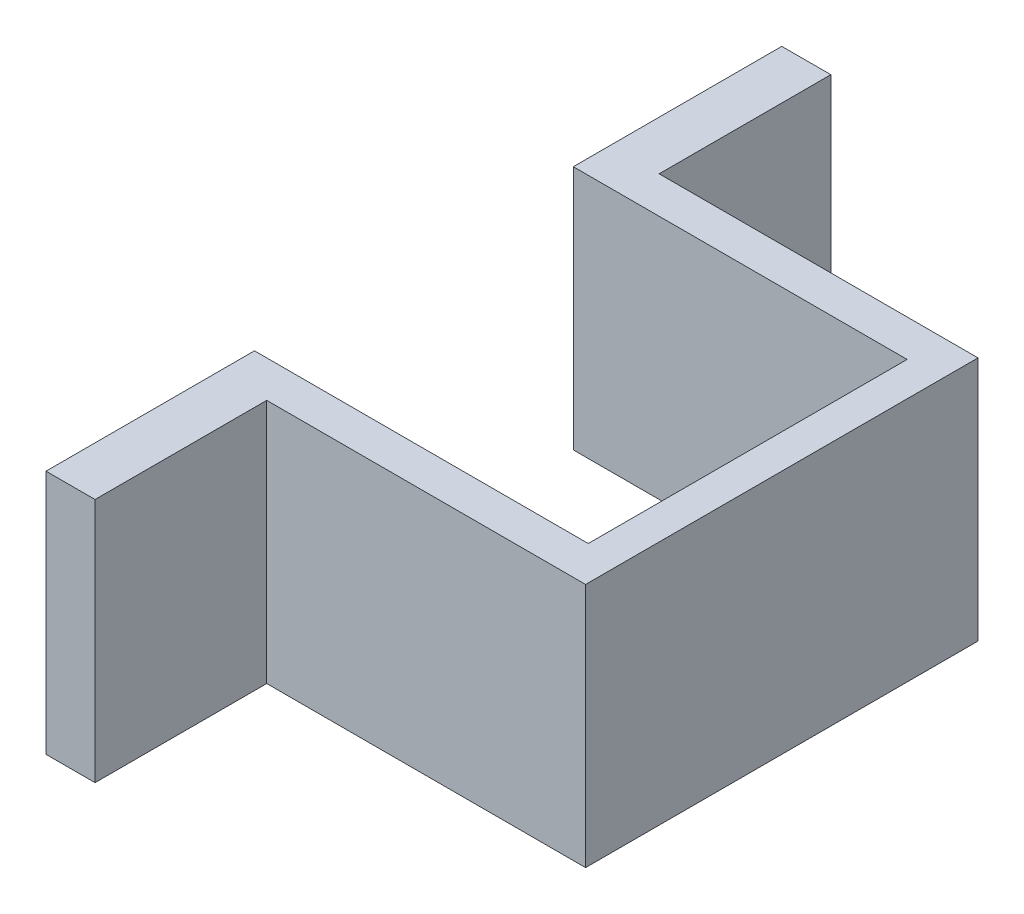
ISO-10303-21;
HEADER;
FILE_DESCRIPTION(('STEP AP214'),'2;1');
FILE_NAME('part.step','',(''),(''),'','','');
FILE_SCHEMA(('AUTOMOTIVE_DESIGN { 1 0 10303 214 1 1 1 1 }'));
ENDSEC;
DATA;
#1=APPLICATION_CONTEXT('core data for automotive mechanical design processes');
#2=APPLICATION_PROTOCOL_DEFINITION('international standard','automotive_design',2000,#1);
#3=PRODUCT_CONTEXT('',#1,'mechanical');
#4=PRODUCT('Part','Part','',(#3));
#5=PRODUCT_RELATED_PRODUCT_CATEGORY('part','',(#4));
#6=PRODUCT_DEFINITION_FORMATION('','',#4);
#7=PRODUCT_DEFINITION_CONTEXT('part definition',#1,'design');
#8=PRODUCT_DEFINITION('design','',#6,#7);
#9=PRODUCT_DEFINITION_SHAPE('','',#8);
#10=(LENGTH_UNIT() NAMED_UNIT(*) SI_UNIT(.MILLI.,.METRE.));
#11=(NAMED_UNIT(*) PLANE_ANGLE_UNIT() SI_UNIT($,.RADIAN.));
#12=(NAMED_UNIT(*) SI_UNIT($,.STERADIAN.) SOLID_ANGLE_UNIT());
#13=UNCERTAINTY_MEASURE_WITH_UNIT(LENGTH_MEASURE(1.E-05),#10,'distance_accuracy_value','');
#14=(GEOMETRIC_REPRESENTATION_CONTEXT(3) GLOBAL_UNCERTAINTY_ASSIGNED_CONTEXT((#13)) GLOBAL_UNIT_ASSIGNED_CONTEXT((#10,
#11,#12)) REPRESENTATION_CONTEXT('',''));
#15=CARTESIAN_POINT('',(0.,0.,0.));
#16=DIRECTION('',(0.,0.,1.));
#17=DIRECTION('',(1.,0.,0.));
#18=AXIS2_PLACEMENT_3D('',#15,#16,#17);
#19=CARTESIAN_POINT('',(8.84,0.,0.));
#20=DIRECTION('',(-1.,0.,0.));
#21=DIRECTION('',(0.,0.,1.));
#22=AXIS2_PLACEMENT_3D('',#19,#20,#21);
#23=PLANE('',#22);
#24=DIRECTION('',(0.,-1.,0.));
#25=VECTOR('',#24,1.);
#26=CARTESIAN_POINT('',(8.83999999999999,0.,-15.));
#27=LINE('',#26,#25);
#28=CARTESIAN_POINT('',(8.84,49.5,-15.));
#29=VERTEX_POINT('',#28);
#30=CARTESIAN_POINT('',(8.84,39.5,-15.));
#31=VERTEX_POINT('',#30);
#32=EDGE_CURVE('E39',#29,#31,#27,.T.);
#33=ORIENTED_EDGE('',*,*,#32,.T.);
#34=DIRECTION('',(0.,0.,-1.));
#35=VECTOR('',#34,1.);
#36=CARTESIAN_POINT('',(8.84,39.5,0.));
#37=LINE('',#36,#35);
#38=CARTESIAN_POINT('',(8.84,39.5,-6.5));
#39=VERTEX_POINT('',#38);
#40=EDGE_CURVE('E50',#39,#31,#37,.T.);
#41=ORIENTED_EDGE('',*,*,#40,.F.);
#42=DIRECTION('',(0.,-1.,0.));
#43=VECTOR('',#42,1.);
#44=CARTESIAN_POINT('',(8.84,49.5,-6.5));
#45=LINE('',#44,#43);
#46=CARTESIAN_POINT('',(8.84,49.5,-6.5));
#47=VERTEX_POINT('',#46);
#48=EDGE_CURVE('E210',#47,#39,#45,.T.);
#49=ORIENTED_EDGE('',*,*,#48,.F.);
#50=DIRECTION('',(0.,0.,-1.));
#51=VECTOR('',#50,1.);
#52=CARTESIAN_POINT('',(8.84,49.5,0.));
#53=LINE('',#52,#51);
#54=EDGE_CURVE('E211',#47,#29,#53,.T.);
#55=ORIENTED_EDGE('',*,*,#54,.T.);
#56=EDGE_LOOP('',(#33,#41,#49,#55));
#57=FACE_BOUND('',#56,.T.);
#58=ADVANCED_FACE('F35',(#57),#23,.T.);
#59=CARTESIAN_POINT('',(0.,0.,15.));
#60=DIRECTION('',(0.,0.,-1.));
#61=DIRECTION('',(-1.,0.,0.));
#62=AXIS2_PLACEMENT_3D('',#59,#60,#61);
#63=PLANE('',#62);
#64=DIRECTION('',(1.,0.,0.));
#65=VECTOR('',#64,1.);
#66=CARTESIAN_POINT('',(0.,49.5,15.));
#67=LINE('',#66,#65);
#68=CARTESIAN_POINT('',(8.84,49.5,15.));
#69=VERTEX_POINT('',#68);
#70=CARTESIAN_POINT('',(10.84,49.5,15.));
#71=VERTEX_POINT('',#70);
#72=EDGE_CURVE('E150',#69,#71,#67,.T.);
#73=ORIENTED_EDGE('',*,*,#72,.F.);
#74=DIRECTION('',(0.,-1.,0.));
#75=VECTOR('',#74,1.);
#76=CARTESIAN_POINT('',(8.83999999999999,0.,15.));
#77=LINE('',#76,#75);
#78=CARTESIAN_POINT('',(8.84,39.5,15.));
#79=VERTEX_POINT('',#78);
#80=EDGE_CURVE('E215',#69,#79,#77,.T.);
#81=ORIENTED_EDGE('',*,*,#80,.T.);
#82=DIRECTION('',(-1.,0.,0.));
#83=VECTOR('',#82,1.);
#84=CARTESIAN_POINT('',(23.84,39.5,15.));
#85=LINE('',#84,#83);
#86=CARTESIAN_POINT('',(10.84,39.5,15.));
#87=VERTEX_POINT('',#86);
#88=EDGE_CURVE('E191',#87,#79,#85,.T.);
#89=ORIENTED_EDGE('',*,*,#88,.F.);
#90=DIRECTION('',(0.,1.,0.));
#91=VECTOR('',#90,1.);
#92=CARTESIAN_POINT('',(10.84,36.5,15.));
#93=LINE('',#92,#91);
#94=EDGE_CURVE('E136',#87,#71,#93,.T.);
#95=ORIENTED_EDGE('',*,*,#94,.T.);
#96=EDGE_LOOP('',(#73,#81,#89,#95));
#97=FACE_BOUND('',#96,.T.);
#98=ADVANCED_FACE('F249',(#97),#63,.F.);
#99=CARTESIAN_POINT('',(0.,39.5,0.));
#100=DIRECTION('',(0.,1.,0.));
#101=DIRECTION('',(0.,0.,1.));
#102=AXIS2_PLACEMENT_3D('',#99,#100,#101);
#103=PLANE('',#102);
#104=ORIENTED_EDGE('',*,*,#88,.T.);
#105=CARTESIAN_POINT('',(8.84,39.5,6.5));
#106=VERTEX_POINT('',#105);
#107=EDGE_CURVE('E214',#79,#106,#37,.T.);
#108=ORIENTED_EDGE('',*,*,#107,.T.);
#109=DIRECTION('',(1.,0.,0.));
#110=VECTOR('',#109,1.);
#111=CARTESIAN_POINT('',(0.,39.5,6.5));
#112=LINE('',#111,#110);
#113=CARTESIAN_POINT('',(22.45,39.5,6.5));
#114=VERTEX_POINT('',#113);
#115=EDGE_CURVE('E200',#106,#114,#112,.T.);
#116=ORIENTED_EDGE('',*,*,#115,.T.);
#117=DIRECTION('',(0.,0.,-1.));
#118=VECTOR('',#117,1.);
#119=CARTESIAN_POINT('',(22.45,39.5,0.));
#120=LINE('',#119,#118);
#121=CARTESIAN_POINT('',(22.45,39.5,-6.5));
#122=VERTEX_POINT('',#121);
#123=EDGE_CURVE('E176',#114,#122,#120,.T.);
#124=ORIENTED_EDGE('',*,*,#123,.T.);
#125=DIRECTION('',(1.,0.,0.));
#126=VECTOR('',#125,1.);
#127=CARTESIAN_POINT('',(0.,39.5,-6.5));
#128=LINE('',#127,#126);
#129=EDGE_CURVE('E194',#39,#122,#128,.T.);
#130=ORIENTED_EDGE('',*,*,#129,.F.);
#131=ORIENTED_EDGE('',*,*,#40,.T.);
#132=DIRECTION('',(-1.,0.,0.));
#133=VECTOR('',#132,1.);
#134=CARTESIAN_POINT('',(23.84,39.5,-15.));
#135=LINE('',#134,#133);
#136=CARTESIAN_POINT('',(10.84,39.5,-15.));
#137=VERTEX_POINT('',#136);
#138=EDGE_CURVE('E188',#137,#31,#135,.T.);
#139=ORIENTED_EDGE('',*,*,#138,.F.);
#140=DIRECTION('',(0.,0.,1.));
#141=VECTOR('',#140,1.);
#142=CARTESIAN_POINT('',(10.84,39.5,0.));
#143=LINE('',#142,#141);
#144=CARTESIAN_POINT('',(10.84,39.5,-8.));
#145=VERTEX_POINT('',#144);
#146=EDGE_CURVE('E179',#137,#145,#143,.T.);
#147=ORIENTED_EDGE('',*,*,#146,.T.);
#148=DIRECTION('',(1.,0.,0.));
#149=VECTOR('',#148,1.);
#150=CARTESIAN_POINT('',(0.,39.5,-8.));
#151=LINE('',#150,#149);
#152=CARTESIAN_POINT('',(23.84,39.5,-8.));
#153=VERTEX_POINT('',#152);
#154=EDGE_CURVE('E153',#145,#153,#151,.T.);
#155=ORIENTED_EDGE('',*,*,#154,.T.);
#156=DIRECTION('',(0.,0.,-1.));
#157=VECTOR('',#156,1.);
#158=CARTESIAN_POINT('',(23.84,39.5,15.));
#159=LINE('',#158,#157);
#160=CARTESIAN_POINT('',(23.84,39.5,8.));
#161=VERTEX_POINT('',#160);
#162=EDGE_CURVE('E183',#161,#153,#159,.T.);
#163=ORIENTED_EDGE('',*,*,#162,.F.);
#164=DIRECTION('',(1.,0.,0.));
#165=VECTOR('',#164,1.);
#166=CARTESIAN_POINT('',(0.,39.5,8.));
#167=LINE('',#166,#165);
#168=CARTESIAN_POINT('',(10.84,39.5,8.));
#169=VERTEX_POINT('',#168);
#170=EDGE_CURVE('E174',#169,#161,#167,.T.);
#171=ORIENTED_EDGE('',*,*,#170,.F.);
#172=DIRECTION('',(0.,0.,-1.));
#173=VECTOR('',#172,1.);
#174=CARTESIAN_POINT('',(10.84,39.5,0.));
#175=LINE('',#174,#173);
#176=EDGE_CURVE('E133',#87,#169,#175,.T.);
#177=ORIENTED_EDGE('',*,*,#176,.F.);
#178=EDGE_LOOP('',(#104,#108,#116,#124,#130,#131,#139,#147,#155,#163,#171,#177));
#179=FACE_BOUND('',#178,.T.);
#180=ADVANCED_FACE('F224',(#179),#103,.F.);
#181=CARTESIAN_POINT('',(0.,49.5,0.));
#182=DIRECTION('',(0.,1.,0.));
#183=DIRECTION('',(0.,0.,1.));
#184=AXIS2_PLACEMENT_3D('',#181,#182,#183);
#185=PLANE('',#184);
#186=CARTESIAN_POINT('',(8.84,49.5,6.5));
#187=VERTEX_POINT('',#186);
#188=EDGE_CURVE('E57',#69,#187,#53,.T.);
#189=ORIENTED_EDGE('',*,*,#188,.F.);
#190=ORIENTED_EDGE('',*,*,#72,.T.);
#191=DIRECTION('',(0.,0.,-1.));
#192=VECTOR('',#191,1.);
#193=CARTESIAN_POINT('',(10.84,49.5,0.));
#194=LINE('',#193,#192);
#195=CARTESIAN_POINT('',(10.84,49.5,8.));
#196=VERTEX_POINT('',#195);
#197=EDGE_CURVE('E130',#71,#196,#194,.T.);
#198=ORIENTED_EDGE('',*,*,#197,.T.);
#199=DIRECTION('',(1.,0.,0.));
#200=VECTOR('',#199,1.);
#201=CARTESIAN_POINT('',(0.,49.5,8.));
#202=LINE('',#201,#200);
#203=CARTESIAN_POINT('',(23.84,49.5,8.));
#204=VERTEX_POINT('',#203);
#205=EDGE_CURVE('E139',#196,#204,#202,.T.);
#206=ORIENTED_EDGE('',*,*,#205,.T.);
#207=DIRECTION('',(0.,0.,1.));
#208=VECTOR('',#207,1.);
#209=CARTESIAN_POINT('',(23.84,49.5,15.));
#210=LINE('',#209,#208);
#211=CARTESIAN_POINT('',(23.84,49.5,-8.));
#212=VERTEX_POINT('',#211);
#213=EDGE_CURVE('E186',#212,#204,#210,.T.);
#214=ORIENTED_EDGE('',*,*,#213,.F.);
#215=DIRECTION('',(1.,0.,0.));
#216=VECTOR('',#215,1.);
#217=CARTESIAN_POINT('',(0.,49.5,-8.));
#218=LINE('',#217,#216);
#219=CARTESIAN_POINT('',(10.84,49.5,-8.));
#220=VERTEX_POINT('',#219);
#221=EDGE_CURVE('E158',#220,#212,#218,.T.);
#222=ORIENTED_EDGE('',*,*,#221,.F.);
#223=DIRECTION('',(0.,0.,1.));
#224=VECTOR('',#223,1.);
#225=CARTESIAN_POINT('',(10.84,49.5,0.));
#226=LINE('',#225,#224);
#227=CARTESIAN_POINT('',(10.84,49.5,-15.));
#228=VERTEX_POINT('',#227);
#229=EDGE_CURVE('E155',#228,#220,#226,.T.);
#230=ORIENTED_EDGE('',*,*,#229,.F.);
#231=DIRECTION('',(-1.,0.,0.));
#232=VECTOR('',#231,1.);
#233=CARTESIAN_POINT('',(0.,49.5,-15.));
#234=LINE('',#233,#232);
#235=EDGE_CURVE('E195',#228,#29,#234,.T.);
#236=ORIENTED_EDGE('',*,*,#235,.T.);
#237=ORIENTED_EDGE('',*,*,#54,.F.);
#238=DIRECTION('',(1.,0.,0.));
#239=VECTOR('',#238,1.);
#240=CARTESIAN_POINT('',(0.,49.5,-6.5));
#241=LINE('',#240,#239);
#242=CARTESIAN_POINT('',(22.45,49.5,-6.5));
#243=VERTEX_POINT('',#242);
#244=EDGE_CURVE('E198',#47,#243,#241,.T.);
#245=ORIENTED_EDGE('',*,*,#244,.T.);
#246=DIRECTION('',(0.,0.,-1.));
#247=VECTOR('',#246,1.);
#248=CARTESIAN_POINT('',(22.45,49.5,0.));
#249=LINE('',#248,#247);
#250=CARTESIAN_POINT('',(22.45,49.5,6.5));
#251=VERTEX_POINT('',#250);
#252=EDGE_CURVE('E164',#251,#243,#249,.T.);
#253=ORIENTED_EDGE('',*,*,#252,.F.);
#254=DIRECTION('',(1.,0.,0.));
#255=VECTOR('',#254,1.);
#256=CARTESIAN_POINT('',(0.,49.5,6.5));
#257=LINE('',#256,#255);
#258=EDGE_CURVE('E202',#187,#251,#257,.T.);
#259=ORIENTED_EDGE('',*,*,#258,.F.);
#260=EDGE_LOOP('',(#189,#190,#198,#206,#214,#222,#230,#236,#237,#245,#253,#259));
#261=FACE_BOUND('',#260,.T.);
#262=ADVANCED_FACE('F148',(#261),#185,.T.);
#263=CARTESIAN_POINT('',(23.84,0.,0.));
#264=DIRECTION('',(-1.,0.,0.));
#265=DIRECTION('',(0.,0.,1.));
#266=AXIS2_PLACEMENT_3D('',#263,#264,#265);
#267=PLANE('',#266);
#268=DIRECTION('',(0.,1.,0.));
#269=VECTOR('',#268,1.);
#270=CARTESIAN_POINT('',(23.84,0.,8.));
#271=LINE('',#270,#269);
#272=EDGE_CURVE('E142',#161,#204,#271,.T.);
#273=ORIENTED_EDGE('',*,*,#272,.F.);
#274=ORIENTED_EDGE('',*,*,#162,.T.);
#275=DIRECTION('',(0.,1.,0.));
#276=VECTOR('',#275,1.);
#277=CARTESIAN_POINT('',(23.84,0.,-8.));
#278=LINE('',#277,#276);
#279=EDGE_CURVE('E205',#153,#212,#278,.T.);
#280=ORIENTED_EDGE('',*,*,#279,.T.);
#281=ORIENTED_EDGE('',*,*,#213,.T.);
#282=EDGE_LOOP('',(#273,#274,#280,#281));
#283=FACE_BOUND('',#282,.T.);
#284=ADVANCED_FACE('F246',(#283),#267,.F.);
#285=CARTESIAN_POINT('',(0.,0.,-15.));
#286=DIRECTION('',(0.,0.,-1.));
#287=DIRECTION('',(-1.,0.,0.));
#288=AXIS2_PLACEMENT_3D('',#285,#286,#287);
#289=PLANE('',#288);
#290=ORIENTED_EDGE('',*,*,#32,.F.);
#291=ORIENTED_EDGE('',*,*,#235,.F.);
#292=DIRECTION('',(0.,1.,0.));
#293=VECTOR('',#292,1.);
#294=CARTESIAN_POINT('',(10.84,36.5,-15.));
#295=LINE('',#294,#293);
#296=EDGE_CURVE('E146',#137,#228,#295,.T.);
#297=ORIENTED_EDGE('',*,*,#296,.F.);
#298=ORIENTED_EDGE('',*,*,#138,.T.);
#299=EDGE_LOOP('',(#290,#291,#297,#298));
#300=FACE_BOUND('',#299,.T.);
#301=ADVANCED_FACE('F37',(#300),#289,.T.);
#302=CARTESIAN_POINT('',(0.,49.5,6.5));
#303=DIRECTION('',(0.,0.,-1.));
#304=DIRECTION('',(-1.,0.,0.));
#305=AXIS2_PLACEMENT_3D('',#302,#303,#304);
#306=PLANE('',#305);
#307=DIRECTION('',(0.,-1.,0.));
#308=VECTOR('',#307,1.);
#309=CARTESIAN_POINT('',(8.84,49.5,6.5));
#310=LINE('',#309,#308);
#311=EDGE_CURVE('E11',#187,#106,#310,.T.);
#312=ORIENTED_EDGE('',*,*,#311,.F.);
#313=ORIENTED_EDGE('',*,*,#258,.T.);
#314=DIRECTION('',(0.,1.,0.));
#315=VECTOR('',#314,1.);
#316=CARTESIAN_POINT('',(22.45,36.5,6.5));
#317=LINE('',#316,#315);
#318=EDGE_CURVE('E167',#114,#251,#317,.T.);
#319=ORIENTED_EDGE('',*,*,#318,.F.);
#320=ORIENTED_EDGE('',*,*,#115,.F.);
#321=EDGE_LOOP('',(#312,#313,#319,#320));
#322=FACE_BOUND('',#321,.T.);
#323=ADVANCED_FACE('F232',(#322),#306,.T.);
#324=CARTESIAN_POINT('',(0.,49.5,-6.5));
#325=DIRECTION('',(0.,0.,-1.));
#326=DIRECTION('',(-1.,0.,0.));
#327=AXIS2_PLACEMENT_3D('',#324,#325,#326);
#328=PLANE('',#327);
#329=ORIENTED_EDGE('',*,*,#244,.F.);
#330=ORIENTED_EDGE('',*,*,#48,.T.);
#331=ORIENTED_EDGE('',*,*,#129,.T.);
#332=DIRECTION('',(0.,1.,0.));
#333=VECTOR('',#332,1.);
#334=CARTESIAN_POINT('',(22.45,36.5,-6.5));
#335=LINE('',#334,#333);
#336=EDGE_CURVE('E159',#122,#243,#335,.T.);
#337=ORIENTED_EDGE('',*,*,#336,.T.);
#338=EDGE_LOOP('',(#329,#330,#331,#337));
#339=FACE_BOUND('',#338,.T.);
#340=ADVANCED_FACE('F220',(#339),#328,.F.);
#341=CARTESIAN_POINT('',(10.84,36.5,0.));
#342=DIRECTION('',(-1.,0.,0.));
#343=DIRECTION('',(0.,0.,1.));
#344=AXIS2_PLACEMENT_3D('',#341,#342,#343);
#345=PLANE('',#344);
#346=ORIENTED_EDGE('',*,*,#296,.T.);
#347=ORIENTED_EDGE('',*,*,#229,.T.);
#348=DIRECTION('',(0.,1.,0.));
#349=VECTOR('',#348,1.);
#350=CARTESIAN_POINT('',(10.84,36.5,-8.));
#351=LINE('',#350,#349);
#352=EDGE_CURVE('E161',#145,#220,#351,.T.);
#353=ORIENTED_EDGE('',*,*,#352,.F.);
#354=ORIENTED_EDGE('',*,*,#146,.F.);
#355=EDGE_LOOP('',(#346,#347,#353,#354));
#356=FACE_BOUND('',#355,.T.);
#357=ADVANCED_FACE('F241',(#356),#345,.F.);
#358=CARTESIAN_POINT('',(0.,36.5,-8.));
#359=DIRECTION('',(0.,0.,1.));
#360=DIRECTION('',(1.,0.,0.));
#361=AXIS2_PLACEMENT_3D('',#358,#359,#360);
#362=PLANE('',#361);
#363=ORIENTED_EDGE('',*,*,#352,.T.);
#364=ORIENTED_EDGE('',*,*,#221,.T.);
#365=ORIENTED_EDGE('',*,*,#279,.F.);
#366=ORIENTED_EDGE('',*,*,#154,.F.);
#367=EDGE_LOOP('',(#363,#364,#365,#366));
#368=FACE_BOUND('',#367,.T.);
#369=ADVANCED_FACE('F244',(#368),#362,.F.);
#370=CARTESIAN_POINT('',(10.84,36.5,0.));
#371=DIRECTION('',(1.,0.,0.));
#372=DIRECTION('',(0.,0.,-1.));
#373=AXIS2_PLACEMENT_3D('',#370,#371,#372);
#374=PLANE('',#373);
#375=ORIENTED_EDGE('',*,*,#176,.T.);
#376=DIRECTION('',(0.,1.,0.));
#377=VECTOR('',#376,1.);
#378=CARTESIAN_POINT('',(10.84,36.5,8.));
#379=LINE('',#378,#377);
#380=EDGE_CURVE('E126',#169,#196,#379,.T.);
#381=ORIENTED_EDGE('',*,*,#380,.T.);
#382=ORIENTED_EDGE('',*,*,#197,.F.);
#383=ORIENTED_EDGE('',*,*,#94,.F.);
#384=EDGE_LOOP('',(#375,#381,#382,#383));
#385=FACE_BOUND('',#384,.T.);
#386=ADVANCED_FACE('F128',(#385),#374,.T.);
#387=CARTESIAN_POINT('',(0.,36.5,8.));
#388=DIRECTION('',(0.,0.,1.));
#389=DIRECTION('',(1.,0.,0.));
#390=AXIS2_PLACEMENT_3D('',#387,#388,#389);
#391=PLANE('',#390);
#392=ORIENTED_EDGE('',*,*,#170,.T.);
#393=ORIENTED_EDGE('',*,*,#272,.T.);
#394=ORIENTED_EDGE('',*,*,#205,.F.);
#395=ORIENTED_EDGE('',*,*,#380,.F.);
#396=EDGE_LOOP('',(#392,#393,#394,#395));
#397=FACE_BOUND('',#396,.T.);
#398=ADVANCED_FACE('F140',(#397),#391,.T.);
#399=CARTESIAN_POINT('',(22.45,36.5,0.));
#400=DIRECTION('',(1.,0.,0.));
#401=DIRECTION('',(0.,0.,-1.));
#402=AXIS2_PLACEMENT_3D('',#399,#400,#401);
#403=PLANE('',#402);
#404=ORIENTED_EDGE('',*,*,#318,.T.);
#405=ORIENTED_EDGE('',*,*,#252,.T.);
#406=ORIENTED_EDGE('',*,*,#336,.F.);
#407=ORIENTED_EDGE('',*,*,#123,.F.);
#408=EDGE_LOOP('',(#404,#405,#406,#407));
#409=FACE_BOUND('',#408,.T.);
#410=ADVANCED_FACE('F229',(#409),#403,.F.);
#411=ORIENTED_EDGE('',*,*,#311,.T.);
#412=ORIENTED_EDGE('',*,*,#107,.F.);
#413=ORIENTED_EDGE('',*,*,#80,.F.);
#414=ORIENTED_EDGE('',*,*,#188,.T.);
#415=EDGE_LOOP('',(#411,#412,#413,#414));
#416=FACE_BOUND('',#415,.T.);
#417=ADVANCED_FACE('F251',(#416),#23,.T.);
#418=CLOSED_SHELL('',(#58,#98,#180,#262,#284,#301,#323,#340,#357,#369,#386,#398,#410,#417));
#419=MANIFOLD_SOLID_BREP('B2',#418);
#420=ADVANCED_BREP_SHAPE_REPRESENTATION('',(#18,#419),#14);
#421=SHAPE_DEFINITION_REPRESENTATION(#9,#420);
ENDSEC;
END-ISO-10303-21;
